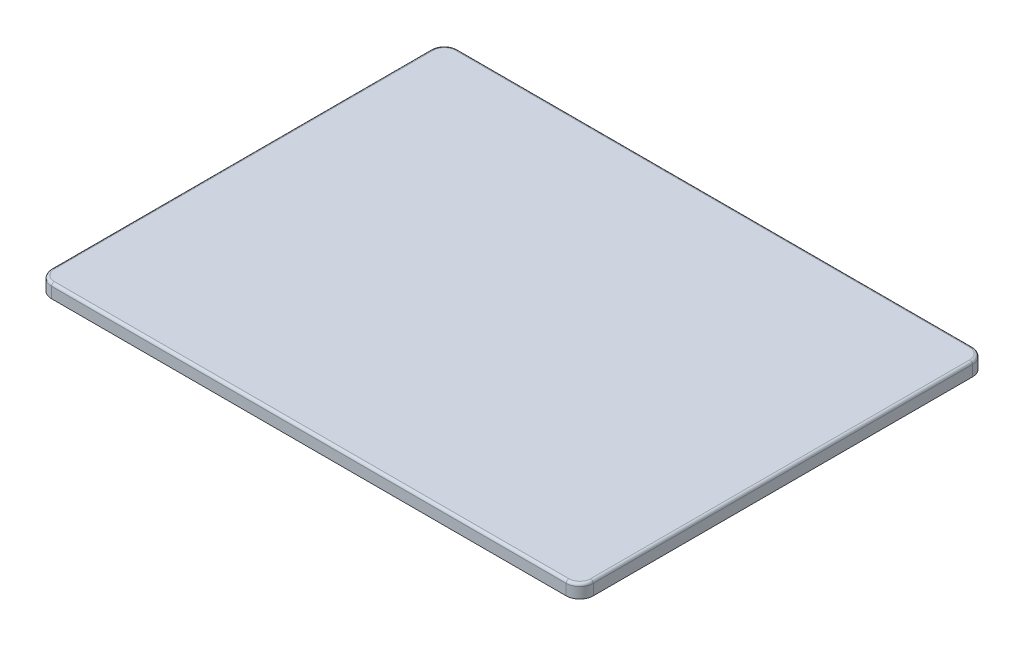
ISO-10303-21;
HEADER;
FILE_DESCRIPTION(('STEP AP214'),'2;1');
FILE_NAME('part.step','',(''),(''),'','','');
FILE_SCHEMA(('AUTOMOTIVE_DESIGN { 1 0 10303 214 1 1 1 1 }'));
ENDSEC;
DATA;
#1=APPLICATION_CONTEXT('core data for automotive mechanical design processes');
#2=APPLICATION_PROTOCOL_DEFINITION('international standard','automotive_design',2000,#1);
#3=PRODUCT_CONTEXT('',#1,'mechanical');
#4=PRODUCT('Part','Part','',(#3));
#5=PRODUCT_RELATED_PRODUCT_CATEGORY('part','',(#4));
#6=PRODUCT_DEFINITION_FORMATION('','',#4);
#7=PRODUCT_DEFINITION_CONTEXT('part definition',#1,'design');
#8=PRODUCT_DEFINITION('design','',#6,#7);
#9=PRODUCT_DEFINITION_SHAPE('','',#8);
#10=(LENGTH_UNIT() NAMED_UNIT(*) SI_UNIT(.MILLI.,.METRE.));
#11=(NAMED_UNIT(*) PLANE_ANGLE_UNIT() SI_UNIT($,.RADIAN.));
#12=(NAMED_UNIT(*) SI_UNIT($,.STERADIAN.) SOLID_ANGLE_UNIT());
#13=UNCERTAINTY_MEASURE_WITH_UNIT(LENGTH_MEASURE(1.E-05),#10,'distance_accuracy_value','');
#14=(GEOMETRIC_REPRESENTATION_CONTEXT(3) GLOBAL_UNCERTAINTY_ASSIGNED_CONTEXT((#13)) GLOBAL_UNIT_ASSIGNED_CONTEXT((#10,
#11,#12)) REPRESENTATION_CONTEXT('',''));
#15=CARTESIAN_POINT('',(0.,0.,0.));
#16=DIRECTION('',(0.,0.,1.));
#17=DIRECTION('',(1.,0.,0.));
#18=AXIS2_PLACEMENT_3D('',#15,#16,#17);
#19=CARTESIAN_POINT('',(25.4,1.27,-19.05));
#20=DIRECTION('',(-1.,0.,0.));
#21=DIRECTION('',(0.,0.,1.));
#22=AXIS2_PLACEMENT_3D('',#19,#20,#21);
#23=PLANE('',#22);
#24=DIRECTION('',(0.,-1.,0.));
#25=VECTOR('',#24,1.);
#26=CARTESIAN_POINT('',(25.4,1.27,-17.78));
#27=LINE('',#26,#25);
#28=CARTESIAN_POINT('',(25.4,0.,-17.78));
#29=VERTEX_POINT('',#28);
#30=CARTESIAN_POINT('',(25.4,1.016,-17.78));
#31=VERTEX_POINT('',#30);
#32=EDGE_CURVE('E129',#29,#31,#27,.F.);
#33=ORIENTED_EDGE('',*,*,#32,.T.);
#34=DIRECTION('',(0.,0.,-1.));
#35=VECTOR('',#34,1.);
#36=CARTESIAN_POINT('',(25.4,1.016,17.78));
#37=LINE('',#36,#35);
#38=CARTESIAN_POINT('',(25.4,1.016,17.78));
#39=VERTEX_POINT('',#38);
#40=EDGE_CURVE('E57',#31,#39,#37,.F.);
#41=ORIENTED_EDGE('',*,*,#40,.T.);
#42=DIRECTION('',(0.,-1.,0.));
#43=VECTOR('',#42,1.);
#44=CARTESIAN_POINT('',(25.4,1.27,17.78));
#45=LINE('',#44,#43);
#46=CARTESIAN_POINT('',(25.4,0.,17.78));
#47=VERTEX_POINT('',#46);
#48=EDGE_CURVE('E122',#39,#47,#45,.T.);
#49=ORIENTED_EDGE('',*,*,#48,.T.);
#50=DIRECTION('',(0.,0.,-1.));
#51=VECTOR('',#50,1.);
#52=CARTESIAN_POINT('',(25.4,0.,-19.05));
#53=LINE('',#52,#51);
#54=EDGE_CURVE('E125',#47,#29,#53,.T.);
#55=ORIENTED_EDGE('',*,*,#54,.T.);
#56=EDGE_LOOP('',(#33,#41,#49,#55));
#57=FACE_BOUND('',#56,.T.);
#58=ADVANCED_FACE('F33',(#57),#23,.F.);
#59=CARTESIAN_POINT('',(-25.4,1.27,-19.05));
#60=DIRECTION('',(0.,0.,1.));
#61=DIRECTION('',(1.,0.,0.));
#62=AXIS2_PLACEMENT_3D('',#59,#60,#61);
#63=PLANE('',#62);
#64=DIRECTION('',(0.,-1.,0.));
#65=VECTOR('',#64,1.);
#66=CARTESIAN_POINT('',(-24.13,1.27,-19.05));
#67=LINE('',#66,#65);
#68=CARTESIAN_POINT('',(-24.13,0.,-19.05));
#69=VERTEX_POINT('',#68);
#70=CARTESIAN_POINT('',(-24.13,1.016,-19.05));
#71=VERTEX_POINT('',#70);
#72=EDGE_CURVE('E162',#69,#71,#67,.F.);
#73=ORIENTED_EDGE('',*,*,#72,.T.);
#74=DIRECTION('',(-1.,0.,0.));
#75=VECTOR('',#74,1.);
#76=CARTESIAN_POINT('',(24.13,1.016,-19.05));
#77=LINE('',#76,#75);
#78=CARTESIAN_POINT('',(24.13,1.016,-19.05));
#79=VERTEX_POINT('',#78);
#80=EDGE_CURVE('E196',#71,#79,#77,.F.);
#81=ORIENTED_EDGE('',*,*,#80,.T.);
#82=DIRECTION('',(0.,-1.,0.));
#83=VECTOR('',#82,1.);
#84=CARTESIAN_POINT('',(24.13,1.27,-19.05));
#85=LINE('',#84,#83);
#86=CARTESIAN_POINT('',(24.13,0.,-19.05));
#87=VERTEX_POINT('',#86);
#88=EDGE_CURVE('E165',#79,#87,#85,.T.);
#89=ORIENTED_EDGE('',*,*,#88,.T.);
#90=DIRECTION('',(-1.,0.,0.));
#91=VECTOR('',#90,1.);
#92=CARTESIAN_POINT('',(-25.4,0.,-19.05));
#93=LINE('',#92,#91);
#94=EDGE_CURVE('E143',#87,#69,#93,.T.);
#95=ORIENTED_EDGE('',*,*,#94,.T.);
#96=EDGE_LOOP('',(#73,#81,#89,#95));
#97=FACE_BOUND('',#96,.T.);
#98=ADVANCED_FACE('F273',(#97),#63,.F.);
#99=CARTESIAN_POINT('',(-25.4,1.27,-19.05));
#100=DIRECTION('',(1.,0.,0.));
#101=DIRECTION('',(0.,0.,-1.));
#102=AXIS2_PLACEMENT_3D('',#99,#100,#101);
#103=PLANE('',#102);
#104=DIRECTION('',(0.,-1.,0.));
#105=VECTOR('',#104,1.);
#106=CARTESIAN_POINT('',(-25.4,1.27,17.78));
#107=LINE('',#106,#105);
#108=CARTESIAN_POINT('',(-25.4,0.,17.78));
#109=VERTEX_POINT('',#108);
#110=CARTESIAN_POINT('',(-25.4,1.016,17.78));
#111=VERTEX_POINT('',#110);
#112=EDGE_CURVE('E167',#109,#111,#107,.F.);
#113=ORIENTED_EDGE('',*,*,#112,.T.);
#114=DIRECTION('',(0.,0.,1.));
#115=VECTOR('',#114,1.);
#116=CARTESIAN_POINT('',(-25.4,1.016,-17.78));
#117=LINE('',#116,#115);
#118=CARTESIAN_POINT('',(-25.4,1.016,-17.78));
#119=VERTEX_POINT('',#118);
#120=EDGE_CURVE('E192',#111,#119,#117,.F.);
#121=ORIENTED_EDGE('',*,*,#120,.T.);
#122=DIRECTION('',(0.,-1.,0.));
#123=VECTOR('',#122,1.);
#124=CARTESIAN_POINT('',(-25.4,1.27,-17.78));
#125=LINE('',#124,#123);
#126=CARTESIAN_POINT('',(-25.4,0.,-17.78));
#127=VERTEX_POINT('',#126);
#128=EDGE_CURVE('E170',#119,#127,#125,.T.);
#129=ORIENTED_EDGE('',*,*,#128,.T.);
#130=DIRECTION('',(0.,0.,1.));
#131=VECTOR('',#130,1.);
#132=CARTESIAN_POINT('',(-25.4,0.,-19.05));
#133=LINE('',#132,#131);
#134=EDGE_CURVE('E146',#127,#109,#133,.T.);
#135=ORIENTED_EDGE('',*,*,#134,.T.);
#136=EDGE_LOOP('',(#113,#121,#129,#135));
#137=FACE_BOUND('',#136,.T.);
#138=ADVANCED_FACE('F258',(#137),#103,.F.);
#139=CARTESIAN_POINT('',(-25.4,1.27,19.05));
#140=DIRECTION('',(0.,0.,-1.));
#141=DIRECTION('',(-1.,0.,0.));
#142=AXIS2_PLACEMENT_3D('',#139,#140,#141);
#143=PLANE('',#142);
#144=DIRECTION('',(0.,-1.,0.));
#145=VECTOR('',#144,1.);
#146=CARTESIAN_POINT('',(24.13,1.27,19.05));
#147=LINE('',#146,#145);
#148=CARTESIAN_POINT('',(24.13,0.,19.05));
#149=VERTEX_POINT('',#148);
#150=CARTESIAN_POINT('',(24.13,1.016,19.05));
#151=VERTEX_POINT('',#150);
#152=EDGE_CURVE('E133',#149,#151,#147,.F.);
#153=ORIENTED_EDGE('',*,*,#152,.T.);
#154=DIRECTION('',(1.,0.,0.));
#155=VECTOR('',#154,1.);
#156=CARTESIAN_POINT('',(-24.13,1.016,19.05));
#157=LINE('',#156,#155);
#158=CARTESIAN_POINT('',(-24.13,1.016,19.05));
#159=VERTEX_POINT('',#158);
#160=EDGE_CURVE('E11',#151,#159,#157,.F.);
#161=ORIENTED_EDGE('',*,*,#160,.T.);
#162=DIRECTION('',(0.,-1.,0.));
#163=VECTOR('',#162,1.);
#164=CARTESIAN_POINT('',(-24.13,1.27,19.05));
#165=LINE('',#164,#163);
#166=CARTESIAN_POINT('',(-24.13,0.,19.05));
#167=VERTEX_POINT('',#166);
#168=EDGE_CURVE('E137',#159,#167,#165,.T.);
#169=ORIENTED_EDGE('',*,*,#168,.T.);
#170=DIRECTION('',(1.,0.,0.));
#171=VECTOR('',#170,1.);
#172=CARTESIAN_POINT('',(-25.4,0.,19.05));
#173=LINE('',#172,#171);
#174=EDGE_CURVE('E153',#167,#149,#173,.T.);
#175=ORIENTED_EDGE('',*,*,#174,.T.);
#176=EDGE_LOOP('',(#153,#161,#169,#175));
#177=FACE_BOUND('',#176,.T.);
#178=ADVANCED_FACE('F241',(#177),#143,.F.);
#179=CARTESIAN_POINT('',(0.,1.27,0.));
#180=DIRECTION('',(0.,1.,0.));
#181=DIRECTION('',(0.,0.,1.));
#182=AXIS2_PLACEMENT_3D('',#179,#180,#181);
#183=PLANE('',#182);
#184=DIRECTION('',(0.,0.,1.));
#185=VECTOR('',#184,1.);
#186=CARTESIAN_POINT('',(-25.146,1.27,17.78));
#187=LINE('',#186,#185);
#188=CARTESIAN_POINT('',(-25.146,1.27,-17.78));
#189=VERTEX_POINT('',#188);
#190=CARTESIAN_POINT('',(-25.146,1.27,17.78));
#191=VERTEX_POINT('',#190);
#192=EDGE_CURVE('E184',#189,#191,#187,.T.);
#193=ORIENTED_EDGE('',*,*,#192,.T.);
#194=CARTESIAN_POINT('',(-24.13,1.27,17.78));
#195=DIRECTION('',(0.,1.,0.));
#196=DIRECTION('',(0.,0.,1.));
#197=AXIS2_PLACEMENT_3D('',#194,#195,#196);
#198=CIRCLE('',#197,1.016);
#199=CARTESIAN_POINT('',(-24.13,1.27,18.796));
#200=VERTEX_POINT('',#199);
#201=EDGE_CURVE('E186',#191,#200,#198,.T.);
#202=ORIENTED_EDGE('',*,*,#201,.T.);
#203=DIRECTION('',(1.,0.,0.));
#204=VECTOR('',#203,1.);
#205=CARTESIAN_POINT('',(24.13,1.27,18.796));
#206=LINE('',#205,#204);
#207=CARTESIAN_POINT('',(24.13,1.27,18.796));
#208=VERTEX_POINT('',#207);
#209=EDGE_CURVE('E172',#200,#208,#206,.T.);
#210=ORIENTED_EDGE('',*,*,#209,.T.);
#211=CARTESIAN_POINT('',(24.13,1.27,17.78));
#212=DIRECTION('',(0.,1.,0.));
#213=DIRECTION('',(0.,0.,1.));
#214=AXIS2_PLACEMENT_3D('',#211,#212,#213);
#215=CIRCLE('',#214,1.016);
#216=CARTESIAN_POINT('',(25.146,1.27,17.78));
#217=VERTEX_POINT('',#216);
#218=EDGE_CURVE('E174',#208,#217,#215,.T.);
#219=ORIENTED_EDGE('',*,*,#218,.T.);
#220=DIRECTION('',(0.,0.,-1.));
#221=VECTOR('',#220,1.);
#222=CARTESIAN_POINT('',(25.146,1.27,-17.78));
#223=LINE('',#222,#221);
#224=CARTESIAN_POINT('',(25.146,1.27,-17.78));
#225=VERTEX_POINT('',#224);
#226=EDGE_CURVE('E176',#217,#225,#223,.T.);
#227=ORIENTED_EDGE('',*,*,#226,.T.);
#228=CARTESIAN_POINT('',(24.13,1.27,-17.78));
#229=DIRECTION('',(0.,1.,0.));
#230=DIRECTION('',(0.,0.,1.));
#231=AXIS2_PLACEMENT_3D('',#228,#229,#230);
#232=CIRCLE('',#231,1.016);
#233=CARTESIAN_POINT('',(24.13,1.27,-18.796));
#234=VERTEX_POINT('',#233);
#235=EDGE_CURVE('E178',#225,#234,#232,.T.);
#236=ORIENTED_EDGE('',*,*,#235,.T.);
#237=DIRECTION('',(-1.,0.,0.));
#238=VECTOR('',#237,1.);
#239=CARTESIAN_POINT('',(-24.13,1.27,-18.796));
#240=LINE('',#239,#238);
#241=CARTESIAN_POINT('',(-24.13,1.27,-18.796));
#242=VERTEX_POINT('',#241);
#243=EDGE_CURVE('E180',#234,#242,#240,.T.);
#244=ORIENTED_EDGE('',*,*,#243,.T.);
#245=CARTESIAN_POINT('',(-24.13,1.27,-17.78));
#246=DIRECTION('',(0.,1.,0.));
#247=DIRECTION('',(0.,0.,1.));
#248=AXIS2_PLACEMENT_3D('',#245,#246,#247);
#249=CIRCLE('',#248,1.016);
#250=EDGE_CURVE('E182',#242,#189,#249,.T.);
#251=ORIENTED_EDGE('',*,*,#250,.T.);
#252=EDGE_LOOP('',(#193,#202,#210,#219,#227,#236,#244,#251));
#253=FACE_BOUND('',#252,.T.);
#254=ADVANCED_FACE('F228',(#253),#183,.T.);
#255=CARTESIAN_POINT('',(0.,0.,0.));
#256=DIRECTION('',(0.,1.,0.));
#257=DIRECTION('',(0.,0.,1.));
#258=AXIS2_PLACEMENT_3D('',#255,#256,#257);
#259=PLANE('',#258);
#260=ORIENTED_EDGE('',*,*,#54,.F.);
#261=CARTESIAN_POINT('',(24.13,0.,17.78));
#262=DIRECTION('',(0.,1.,0.));
#263=DIRECTION('',(0.,0.,1.));
#264=AXIS2_PLACEMENT_3D('',#261,#262,#263);
#265=CIRCLE('',#264,1.27);
#266=EDGE_CURVE('E131',#47,#149,#265,.F.);
#267=ORIENTED_EDGE('',*,*,#266,.T.);
#268=ORIENTED_EDGE('',*,*,#174,.F.);
#269=CARTESIAN_POINT('',(-24.13,0.,17.78));
#270=DIRECTION('',(0.,1.,0.));
#271=DIRECTION('',(0.,0.,1.));
#272=AXIS2_PLACEMENT_3D('',#269,#270,#271);
#273=CIRCLE('',#272,1.27);
#274=EDGE_CURVE('E128',#167,#109,#273,.F.);
#275=ORIENTED_EDGE('',*,*,#274,.T.);
#276=ORIENTED_EDGE('',*,*,#134,.F.);
#277=CARTESIAN_POINT('',(-24.13,0.,-17.78));
#278=DIRECTION('',(0.,1.,0.));
#279=DIRECTION('',(0.,0.,1.));
#280=AXIS2_PLACEMENT_3D('',#277,#278,#279);
#281=CIRCLE('',#280,1.27);
#282=EDGE_CURVE('E157',#127,#69,#281,.F.);
#283=ORIENTED_EDGE('',*,*,#282,.T.);
#284=ORIENTED_EDGE('',*,*,#94,.F.);
#285=CARTESIAN_POINT('',(24.13,0.,-17.78));
#286=DIRECTION('',(0.,1.,0.));
#287=DIRECTION('',(0.,0.,1.));
#288=AXIS2_PLACEMENT_3D('',#285,#286,#287);
#289=CIRCLE('',#288,1.27);
#290=EDGE_CURVE('E138',#87,#29,#289,.F.);
#291=ORIENTED_EDGE('',*,*,#290,.T.);
#292=EDGE_LOOP('',(#260,#267,#268,#275,#276,#283,#284,#291));
#293=FACE_BOUND('',#292,.T.);
#294=ADVANCED_FACE('F140',(#293),#259,.F.);
#295=CARTESIAN_POINT('',(24.13,1.27,17.78));
#296=DIRECTION('',(0.,-1.,0.));
#297=DIRECTION('',(0.,0.,-1.));
#298=AXIS2_PLACEMENT_3D('',#295,#296,#297);
#299=CYLINDRICAL_SURFACE('',#298,1.27);
#300=ORIENTED_EDGE('',*,*,#48,.F.);
#301=CARTESIAN_POINT('',(24.13,1.016,17.78));
#302=DIRECTION('',(0.,1.,0.));
#303=DIRECTION('',(0.,0.,1.));
#304=AXIS2_PLACEMENT_3D('',#301,#302,#303);
#305=CIRCLE('',#304,1.27);
#306=EDGE_CURVE('E42',#39,#151,#305,.F.);
#307=ORIENTED_EDGE('',*,*,#306,.T.);
#308=ORIENTED_EDGE('',*,*,#152,.F.);
#309=ORIENTED_EDGE('',*,*,#266,.F.);
#310=EDGE_LOOP('',(#300,#307,#308,#309));
#311=FACE_BOUND('',#310,.T.);
#312=ADVANCED_FACE('F132',(#311),#299,.T.);
#313=CARTESIAN_POINT('',(24.13,1.27,-17.78));
#314=DIRECTION('',(0.,-1.,0.));
#315=DIRECTION('',(0.,0.,-1.));
#316=AXIS2_PLACEMENT_3D('',#313,#314,#315);
#317=CYLINDRICAL_SURFACE('',#316,1.27);
#318=ORIENTED_EDGE('',*,*,#88,.F.);
#319=CARTESIAN_POINT('',(24.13,1.016,-17.78));
#320=DIRECTION('',(0.,1.,0.));
#321=DIRECTION('',(0.,0.,1.));
#322=AXIS2_PLACEMENT_3D('',#319,#320,#321);
#323=CIRCLE('',#322,1.27);
#324=EDGE_CURVE('E198',#79,#31,#323,.F.);
#325=ORIENTED_EDGE('',*,*,#324,.T.);
#326=ORIENTED_EDGE('',*,*,#32,.F.);
#327=ORIENTED_EDGE('',*,*,#290,.F.);
#328=EDGE_LOOP('',(#318,#325,#326,#327));
#329=FACE_BOUND('',#328,.T.);
#330=ADVANCED_FACE('F275',(#329),#317,.T.);
#331=CARTESIAN_POINT('',(-24.13,1.27,-17.78));
#332=DIRECTION('',(0.,-1.,0.));
#333=DIRECTION('',(0.,0.,-1.));
#334=AXIS2_PLACEMENT_3D('',#331,#332,#333);
#335=CYLINDRICAL_SURFACE('',#334,1.27);
#336=ORIENTED_EDGE('',*,*,#128,.F.);
#337=CARTESIAN_POINT('',(-24.13,1.016,-17.78));
#338=DIRECTION('',(0.,1.,0.));
#339=DIRECTION('',(0.,0.,1.));
#340=AXIS2_PLACEMENT_3D('',#337,#338,#339);
#341=CIRCLE('',#340,1.27);
#342=EDGE_CURVE('E194',#119,#71,#341,.F.);
#343=ORIENTED_EDGE('',*,*,#342,.T.);
#344=ORIENTED_EDGE('',*,*,#72,.F.);
#345=ORIENTED_EDGE('',*,*,#282,.F.);
#346=EDGE_LOOP('',(#336,#343,#344,#345));
#347=FACE_BOUND('',#346,.T.);
#348=ADVANCED_FACE('F262',(#347),#335,.T.);
#349=CARTESIAN_POINT('',(-24.13,1.27,17.78));
#350=DIRECTION('',(0.,-1.,0.));
#351=DIRECTION('',(0.,0.,-1.));
#352=AXIS2_PLACEMENT_3D('',#349,#350,#351);
#353=CYLINDRICAL_SURFACE('',#352,1.27);
#354=ORIENTED_EDGE('',*,*,#168,.F.);
#355=CARTESIAN_POINT('',(-24.13,1.016,17.78));
#356=DIRECTION('',(0.,1.,0.));
#357=DIRECTION('',(0.,0.,1.));
#358=AXIS2_PLACEMENT_3D('',#355,#356,#357);
#359=CIRCLE('',#358,1.27);
#360=EDGE_CURVE('E189',#159,#111,#359,.F.);
#361=ORIENTED_EDGE('',*,*,#360,.T.);
#362=ORIENTED_EDGE('',*,*,#112,.F.);
#363=ORIENTED_EDGE('',*,*,#274,.F.);
#364=EDGE_LOOP('',(#354,#361,#362,#363));
#365=FACE_BOUND('',#364,.T.);
#366=ADVANCED_FACE('F245',(#365),#353,.T.);
#367=CARTESIAN_POINT('',(24.13,1.016,-17.78));
#368=DIRECTION('',(0.,1.,0.));
#369=DIRECTION('',(0.,0.,1.));
#370=AXIS2_PLACEMENT_3D('',#367,#368,#369);
#371=TOROIDAL_SURFACE('',#370,1.016,0.254);
#372=CARTESIAN_POINT('',(25.146,1.016,-17.78));
#373=DIRECTION('',(0.,0.,1.));
#374=DIRECTION('',(1.,0.,0.));
#375=AXIS2_PLACEMENT_3D('',#372,#373,#374);
#376=CIRCLE('',#375,0.254);
#377=EDGE_CURVE('E149',#31,#225,#376,.T.);
#378=ORIENTED_EDGE('',*,*,#377,.F.);
#379=ORIENTED_EDGE('',*,*,#324,.F.);
#380=CARTESIAN_POINT('',(24.13,1.016,-18.796));
#381=DIRECTION('',(-1.,0.,0.));
#382=DIRECTION('',(0.,0.,1.));
#383=AXIS2_PLACEMENT_3D('',#380,#381,#382);
#384=CIRCLE('',#383,0.254);
#385=EDGE_CURVE('E37',#234,#79,#384,.T.);
#386=ORIENTED_EDGE('',*,*,#385,.F.);
#387=ORIENTED_EDGE('',*,*,#235,.F.);
#388=EDGE_LOOP('',(#378,#379,#386,#387));
#389=FACE_BOUND('',#388,.T.);
#390=ADVANCED_FACE('F35',(#389),#371,.T.);
#391=CARTESIAN_POINT('',(0.,1.016,-18.796));
#392=DIRECTION('',(1.,0.,0.));
#393=DIRECTION('',(0.,0.,-1.));
#394=AXIS2_PLACEMENT_3D('',#391,#392,#393);
#395=CYLINDRICAL_SURFACE('',#394,0.254);
#396=ORIENTED_EDGE('',*,*,#385,.T.);
#397=ORIENTED_EDGE('',*,*,#80,.F.);
#398=CARTESIAN_POINT('',(-24.13,1.016,-18.796));
#399=DIRECTION('',(-1.,0.,0.));
#400=DIRECTION('',(0.,0.,1.));
#401=AXIS2_PLACEMENT_3D('',#398,#399,#400);
#402=CIRCLE('',#401,0.254);
#403=EDGE_CURVE('E215',#242,#71,#402,.T.);
#404=ORIENTED_EDGE('',*,*,#403,.F.);
#405=ORIENTED_EDGE('',*,*,#243,.F.);
#406=EDGE_LOOP('',(#396,#397,#404,#405));
#407=FACE_BOUND('',#406,.T.);
#408=ADVANCED_FACE('F270',(#407),#395,.T.);
#409=CARTESIAN_POINT('',(25.146,1.016,0.));
#410=DIRECTION('',(0.,0.,1.));
#411=DIRECTION('',(1.,0.,0.));
#412=AXIS2_PLACEMENT_3D('',#409,#410,#411);
#413=CYLINDRICAL_SURFACE('',#412,0.254);
#414=ORIENTED_EDGE('',*,*,#377,.T.);
#415=ORIENTED_EDGE('',*,*,#226,.F.);
#416=CARTESIAN_POINT('',(25.146,1.016,17.78));
#417=DIRECTION('',(0.,0.,1.));
#418=DIRECTION('',(1.,0.,0.));
#419=AXIS2_PLACEMENT_3D('',#416,#417,#418);
#420=CIRCLE('',#419,0.254);
#421=EDGE_CURVE('E212',#39,#217,#420,.T.);
#422=ORIENTED_EDGE('',*,*,#421,.F.);
#423=ORIENTED_EDGE('',*,*,#40,.F.);
#424=EDGE_LOOP('',(#414,#415,#422,#423));
#425=FACE_BOUND('',#424,.T.);
#426=ADVANCED_FACE('F221',(#425),#413,.T.);
#427=CARTESIAN_POINT('',(-24.13,1.016,-17.78));
#428=DIRECTION('',(0.,1.,0.));
#429=DIRECTION('',(0.,0.,1.));
#430=AXIS2_PLACEMENT_3D('',#427,#428,#429);
#431=TOROIDAL_SURFACE('',#430,1.016,0.254);
#432=ORIENTED_EDGE('',*,*,#403,.T.);
#433=ORIENTED_EDGE('',*,*,#342,.F.);
#434=CARTESIAN_POINT('',(-25.146,1.016,-17.78));
#435=DIRECTION('',(0.,0.,1.));
#436=DIRECTION('',(1.,0.,0.));
#437=AXIS2_PLACEMENT_3D('',#434,#435,#436);
#438=CIRCLE('',#437,0.254);
#439=EDGE_CURVE('E209',#189,#119,#438,.T.);
#440=ORIENTED_EDGE('',*,*,#439,.F.);
#441=ORIENTED_EDGE('',*,*,#250,.F.);
#442=EDGE_LOOP('',(#432,#433,#440,#441));
#443=FACE_BOUND('',#442,.T.);
#444=ADVANCED_FACE('F266',(#443),#431,.T.);
#445=CARTESIAN_POINT('',(24.13,1.016,17.78));
#446=DIRECTION('',(0.,1.,0.));
#447=DIRECTION('',(0.,0.,1.));
#448=AXIS2_PLACEMENT_3D('',#445,#446,#447);
#449=TOROIDAL_SURFACE('',#448,1.016,0.254);
#450=ORIENTED_EDGE('',*,*,#421,.T.);
#451=ORIENTED_EDGE('',*,*,#218,.F.);
#452=CARTESIAN_POINT('',(24.13,1.016,18.796));
#453=DIRECTION('',(-1.,0.,0.));
#454=DIRECTION('',(0.,0.,1.));
#455=AXIS2_PLACEMENT_3D('',#452,#453,#454);
#456=CIRCLE('',#455,0.254);
#457=EDGE_CURVE('E206',#151,#208,#456,.T.);
#458=ORIENTED_EDGE('',*,*,#457,.F.);
#459=ORIENTED_EDGE('',*,*,#306,.F.);
#460=EDGE_LOOP('',(#450,#451,#458,#459));
#461=FACE_BOUND('',#460,.T.);
#462=ADVANCED_FACE('F234',(#461),#449,.T.);
#463=CARTESIAN_POINT('',(-25.146,1.016,0.));
#464=DIRECTION('',(0.,0.,-1.));
#465=DIRECTION('',(-1.,0.,0.));
#466=AXIS2_PLACEMENT_3D('',#463,#464,#465);
#467=CYLINDRICAL_SURFACE('',#466,0.254);
#468=ORIENTED_EDGE('',*,*,#439,.T.);
#469=ORIENTED_EDGE('',*,*,#120,.F.);
#470=CARTESIAN_POINT('',(-25.146,1.016,17.78));
#471=DIRECTION('',(0.,0.,1.));
#472=DIRECTION('',(1.,0.,0.));
#473=AXIS2_PLACEMENT_3D('',#470,#471,#472);
#474=CIRCLE('',#473,0.254);
#475=EDGE_CURVE('E204',#191,#111,#474,.T.);
#476=ORIENTED_EDGE('',*,*,#475,.F.);
#477=ORIENTED_EDGE('',*,*,#192,.F.);
#478=EDGE_LOOP('',(#468,#469,#476,#477));
#479=FACE_BOUND('',#478,.T.);
#480=ADVANCED_FACE('F254',(#479),#467,.T.);
#481=CARTESIAN_POINT('',(0.,1.016,18.796));
#482=DIRECTION('',(-1.,0.,0.));
#483=DIRECTION('',(0.,0.,1.));
#484=AXIS2_PLACEMENT_3D('',#481,#482,#483);
#485=CYLINDRICAL_SURFACE('',#484,0.254);
#486=ORIENTED_EDGE('',*,*,#457,.T.);
#487=ORIENTED_EDGE('',*,*,#209,.F.);
#488=CARTESIAN_POINT('',(-24.13,1.016,18.796));
#489=DIRECTION('',(-1.,0.,0.));
#490=DIRECTION('',(0.,0.,1.));
#491=AXIS2_PLACEMENT_3D('',#488,#489,#490);
#492=CIRCLE('',#491,0.254);
#493=EDGE_CURVE('E202',#159,#200,#492,.T.);
#494=ORIENTED_EDGE('',*,*,#493,.F.);
#495=ORIENTED_EDGE('',*,*,#160,.F.);
#496=EDGE_LOOP('',(#486,#487,#494,#495));
#497=FACE_BOUND('',#496,.T.);
#498=ADVANCED_FACE('F237',(#497),#485,.T.);
#499=CARTESIAN_POINT('',(-24.13,1.016,17.78));
#500=DIRECTION('',(0.,1.,0.));
#501=DIRECTION('',(0.,0.,1.));
#502=AXIS2_PLACEMENT_3D('',#499,#500,#501);
#503=TOROIDAL_SURFACE('',#502,1.016,0.254);
#504=ORIENTED_EDGE('',*,*,#475,.T.);
#505=ORIENTED_EDGE('',*,*,#360,.F.);
#506=ORIENTED_EDGE('',*,*,#493,.T.);
#507=ORIENTED_EDGE('',*,*,#201,.F.);
#508=EDGE_LOOP('',(#504,#505,#506,#507));
#509=FACE_BOUND('',#508,.T.);
#510=ADVANCED_FACE('F248',(#509),#503,.T.);
#511=CLOSED_SHELL('',(#58,#98,#138,#178,#254,#294,#312,#330,#348,#366,#390,#408,#426,#444,#462,
#480,#498,#510));
#512=MANIFOLD_SOLID_BREP('B2',#511);
#513=ADVANCED_BREP_SHAPE_REPRESENTATION('',(#18,#512),#14);
#514=SHAPE_DEFINITION_REPRESENTATION(#9,#513);
ENDSEC;
END-ISO-10303-21;
